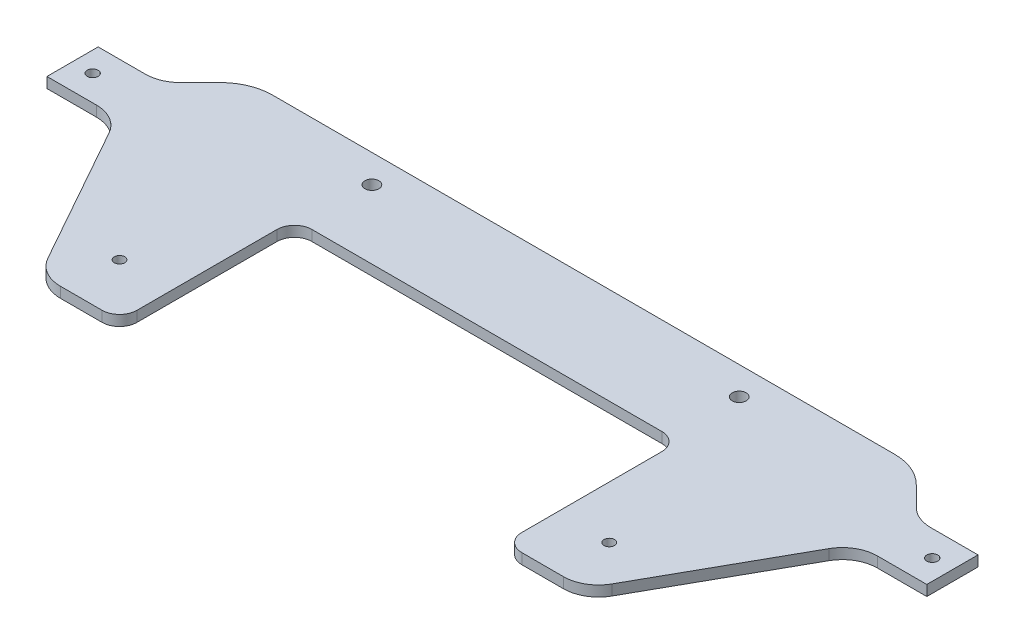
ISO-10303-21;
HEADER;
FILE_DESCRIPTION(('STEP AP214'),'2;1');
FILE_NAME('part.step','',(''),(''),'','','');
FILE_SCHEMA(('AUTOMOTIVE_DESIGN { 1 0 10303 214 1 1 1 1 }'));
ENDSEC;
DATA;
#1=APPLICATION_CONTEXT('core data for automotive mechanical design processes');
#2=APPLICATION_PROTOCOL_DEFINITION('international standard','automotive_design',2000,#1);
#3=PRODUCT_CONTEXT('',#1,'mechanical');
#4=PRODUCT('Part','Part','',(#3));
#5=PRODUCT_RELATED_PRODUCT_CATEGORY('part','',(#4));
#6=PRODUCT_DEFINITION_FORMATION('','',#4);
#7=PRODUCT_DEFINITION_CONTEXT('part definition',#1,'design');
#8=PRODUCT_DEFINITION('design','',#6,#7);
#9=PRODUCT_DEFINITION_SHAPE('','',#8);
#10=(LENGTH_UNIT() NAMED_UNIT(*) SI_UNIT(.MILLI.,.METRE.));
#11=(NAMED_UNIT(*) PLANE_ANGLE_UNIT() SI_UNIT($,.RADIAN.));
#12=(NAMED_UNIT(*) SI_UNIT($,.STERADIAN.) SOLID_ANGLE_UNIT());
#13=UNCERTAINTY_MEASURE_WITH_UNIT(LENGTH_MEASURE(1.E-05),#10,'distance_accuracy_value','');
#14=(GEOMETRIC_REPRESENTATION_CONTEXT(3) GLOBAL_UNCERTAINTY_ASSIGNED_CONTEXT((#13)) GLOBAL_UNIT_ASSIGNED_CONTEXT((#10,
#11,#12)) REPRESENTATION_CONTEXT('',''));
#15=CARTESIAN_POINT('',(0.,0.,0.));
#16=DIRECTION('',(0.,0.,1.));
#17=DIRECTION('',(1.,0.,0.));
#18=AXIS2_PLACEMENT_3D('',#15,#16,#17);
#19=CARTESIAN_POINT('',(-77.75,3.,42.3181711088205));
#20=DIRECTION('',(0.,0.,-1.));
#21=DIRECTION('',(-1.,0.,0.));
#22=AXIS2_PLACEMENT_3D('',#19,#20,#21);
#23=PLANE('',#22);
#24=DIRECTION('',(1.,0.,0.));
#25=VECTOR('',#24,1.);
#26=CARTESIAN_POINT('',(-77.75,0.,42.3181711088205));
#27=LINE('',#26,#25);
#28=CARTESIAN_POINT('',(-71.8887609744845,0.,42.3181711088205));
#29=VERTEX_POINT('',#28);
#30=CARTESIAN_POINT('',(-60.,0.,42.3181711088205));
#31=VERTEX_POINT('',#30);
#32=EDGE_CURVE('E344',#29,#31,#27,.T.);
#33=ORIENTED_EDGE('',*,*,#32,.T.);
#34=DIRECTION('',(0.,1.,0.));
#35=VECTOR('',#34,1.);
#36=CARTESIAN_POINT('',(-60.,3.,42.3181711088205));
#37=LINE('',#36,#35);
#38=CARTESIAN_POINT('',(-60.,3.,42.3181711088205));
#39=VERTEX_POINT('',#38);
#40=EDGE_CURVE('E418',#31,#39,#37,.T.);
#41=ORIENTED_EDGE('',*,*,#40,.T.);
#42=DIRECTION('',(1.,0.,0.));
#43=VECTOR('',#42,1.);
#44=CARTESIAN_POINT('',(-77.75,3.,42.3181711088205));
#45=LINE('',#44,#43);
#46=CARTESIAN_POINT('',(-71.8887609744845,3.,42.3181711088205));
#47=VERTEX_POINT('',#46);
#48=EDGE_CURVE('E322',#47,#39,#45,.T.);
#49=ORIENTED_EDGE('',*,*,#48,.F.);
#50=DIRECTION('',(0.,-1.,0.));
#51=VECTOR('',#50,1.);
#52=CARTESIAN_POINT('',(-71.8887609744845,3.,42.3181711088205));
#53=LINE('',#52,#51);
#54=EDGE_CURVE('E372',#47,#29,#53,.T.);
#55=ORIENTED_EDGE('',*,*,#54,.T.);
#56=EDGE_LOOP('',(#33,#41,#49,#55));
#57=FACE_BOUND('',#56,.T.);
#58=ADVANCED_FACE('F39',(#57),#23,.F.);
#59=CARTESIAN_POINT('',(-88.1,3.,-42.3181711088205));
#60=DIRECTION('',(0.707106781186547,0.,0.707106781186547));
#61=DIRECTION('',(0.707106781186548,0.,-0.707106781186548));
#62=AXIS2_PLACEMENT_3D('',#59,#60,#61);
#63=PLANE('',#62);
#64=DIRECTION('',(-0.707106781186548,0.,0.707106781186548));
#65=VECTOR('',#64,1.);
#66=CARTESIAN_POINT('',(-88.1,3.,-42.3181711088205));
#67=LINE('',#66,#65);
#68=CARTESIAN_POINT('',(-99.4933982822018,3.,-30.9247728266187));
#69=VERTEX_POINT('',#68);
#70=CARTESIAN_POINT('',(-105.171067811865,3.,-25.247103296955));
#71=VERTEX_POINT('',#70);
#72=EDGE_CURVE('E317',#69,#71,#67,.T.);
#73=ORIENTED_EDGE('',*,*,#72,.F.);
#74=DIRECTION('',(0.,-1.,0.));
#75=VECTOR('',#74,1.);
#76=CARTESIAN_POINT('',(-99.4933982822018,3.,-30.9247728266187));
#77=LINE('',#76,#75);
#78=CARTESIAN_POINT('',(-99.4933982822018,0.,-30.9247728266187));
#79=VERTEX_POINT('',#78);
#80=EDGE_CURVE('E11',#69,#79,#77,.T.);
#81=ORIENTED_EDGE('',*,*,#80,.T.);
#82=DIRECTION('',(-0.707106781186548,0.,0.707106781186548));
#83=VECTOR('',#82,1.);
#84=CARTESIAN_POINT('',(-88.1,0.,-42.3181711088205));
#85=LINE('',#84,#83);
#86=CARTESIAN_POINT('',(-105.171067811865,0.,-25.247103296955));
#87=VERTEX_POINT('',#86);
#88=EDGE_CURVE('E312',#79,#87,#85,.T.);
#89=ORIENTED_EDGE('',*,*,#88,.T.);
#90=DIRECTION('',(0.,-1.,0.));
#91=VECTOR('',#90,1.);
#92=CARTESIAN_POINT('',(-105.171067811865,3.,-25.247103296955));
#93=LINE('',#92,#91);
#94=EDGE_CURVE('E368',#87,#71,#93,.F.);
#95=ORIENTED_EDGE('',*,*,#94,.T.);
#96=EDGE_LOOP('',(#73,#81,#89,#95));
#97=FACE_BOUND('',#96,.T.);
#98=ADVANCED_FACE('F513',(#97),#63,.F.);
#99=CARTESIAN_POINT('',(-108.1,3.,-22.3181711088205));
#100=DIRECTION('',(0.,0.,1.));
#101=DIRECTION('',(1.,0.,0.));
#102=AXIS2_PLACEMENT_3D('',#99,#100,#101);
#103=PLANE('',#102);
#104=DIRECTION('',(-1.,0.,0.));
#105=VECTOR('',#104,1.);
#106=CARTESIAN_POINT('',(-108.1,0.,-22.3181711088205));
#107=LINE('',#106,#105);
#108=CARTESIAN_POINT('',(-112.242135623731,0.,-22.3181711088205));
#109=VERTEX_POINT('',#108);
#110=CARTESIAN_POINT('',(-125.75,0.,-22.3181711088205));
#111=VERTEX_POINT('',#110);
#112=EDGE_CURVE('E340',#109,#111,#107,.T.);
#113=ORIENTED_EDGE('',*,*,#112,.T.);
#114=DIRECTION('',(0.,-1.,0.));
#115=VECTOR('',#114,1.);
#116=CARTESIAN_POINT('',(-125.75,3.,-22.3181711088205));
#117=LINE('',#116,#115);
#118=CARTESIAN_POINT('',(-125.75,3.,-22.3181711088205));
#119=VERTEX_POINT('',#118);
#120=EDGE_CURVE('E250',#119,#111,#117,.T.);
#121=ORIENTED_EDGE('',*,*,#120,.F.);
#122=DIRECTION('',(-1.,0.,0.));
#123=VECTOR('',#122,1.);
#124=CARTESIAN_POINT('',(-108.1,3.,-22.3181711088205));
#125=LINE('',#124,#123);
#126=CARTESIAN_POINT('',(-112.242135623731,3.,-22.3181711088205));
#127=VERTEX_POINT('',#126);
#128=EDGE_CURVE('E236',#127,#119,#125,.T.);
#129=ORIENTED_EDGE('',*,*,#128,.F.);
#130=DIRECTION('',(0.,-1.,0.));
#131=VECTOR('',#130,1.);
#132=CARTESIAN_POINT('',(-112.242135623731,0.,-22.3181711088205));
#133=LINE('',#132,#131);
#134=EDGE_CURVE('E393',#127,#109,#133,.T.);
#135=ORIENTED_EDGE('',*,*,#134,.T.);
#136=EDGE_LOOP('',(#113,#121,#129,#135));
#137=FACE_BOUND('',#136,.T.);
#138=ADVANCED_FACE('F523',(#137),#103,.F.);
#139=CARTESIAN_POINT('',(-127.75,3.,-7.6818288911795));
#140=DIRECTION('',(0.,0.,-1.));
#141=DIRECTION('',(-1.,0.,0.));
#142=AXIS2_PLACEMENT_3D('',#139,#140,#141);
#143=PLANE('',#142);
#144=DIRECTION('',(1.,0.,0.));
#145=VECTOR('',#144,1.);
#146=CARTESIAN_POINT('',(-127.75,3.,-7.6818288911795));
#147=LINE('',#146,#145);
#148=CARTESIAN_POINT('',(-125.75,3.,-7.6818288911795));
#149=VERTEX_POINT('',#148);
#150=CARTESIAN_POINT('',(-111.611239025516,3.,-7.6818288911795));
#151=VERTEX_POINT('',#150);
#152=EDGE_CURVE('E228',#149,#151,#147,.T.);
#153=ORIENTED_EDGE('',*,*,#152,.F.);
#154=DIRECTION('',(0.,1.,0.));
#155=VECTOR('',#154,1.);
#156=CARTESIAN_POINT('',(-125.75,0.,-7.6818288911795));
#157=LINE('',#156,#155);
#158=CARTESIAN_POINT('',(-125.75,0.,-7.6818288911795));
#159=VERTEX_POINT('',#158);
#160=EDGE_CURVE('E229',#159,#149,#157,.T.);
#161=ORIENTED_EDGE('',*,*,#160,.F.);
#162=DIRECTION('',(1.,0.,0.));
#163=VECTOR('',#162,1.);
#164=CARTESIAN_POINT('',(-127.75,0.,-7.6818288911795));
#165=LINE('',#164,#163);
#166=CARTESIAN_POINT('',(-111.611239025516,0.,-7.6818288911795));
#167=VERTEX_POINT('',#166);
#168=EDGE_CURVE('E339',#159,#167,#165,.T.);
#169=ORIENTED_EDGE('',*,*,#168,.T.);
#170=DIRECTION('',(0.,-1.,0.));
#171=VECTOR('',#170,1.);
#172=CARTESIAN_POINT('',(-111.611239025516,3.,-7.6818288911795));
#173=LINE('',#172,#171);
#174=EDGE_CURVE('E235',#167,#151,#173,.F.);
#175=ORIENTED_EDGE('',*,*,#174,.T.);
#176=EDGE_LOOP('',(#153,#161,#169,#175));
#177=FACE_BOUND('',#176,.T.);
#178=ADVANCED_FACE('F226',(#177),#143,.F.);
#179=CARTESIAN_POINT('',(-105.75,3.,-7.6818288911795));
#180=DIRECTION('',(0.87250601594972,0.,-0.488603368931844));
#181=DIRECTION('',(-0.488603368931844,0.,-0.87250601594972));
#182=AXIS2_PLACEMENT_3D('',#179,#180,#181);
#183=PLANE('',#182);
#184=DIRECTION('',(0.488603368931844,0.,0.87250601594972));
#185=VECTOR('',#184,1.);
#186=CARTESIAN_POINT('',(-105.75,0.,-7.6818288911795));
#187=LINE('',#186,#185);
#188=CARTESIAN_POINT('',(-102.886178866018,0.,-2.56786258049794));
#189=VERTEX_POINT('',#188);
#190=CARTESIAN_POINT('',(-80.6138211339817,0.,37.2042047981389));
#191=VERTEX_POINT('',#190);
#192=EDGE_CURVE('E341',#189,#191,#187,.T.);
#193=ORIENTED_EDGE('',*,*,#192,.T.);
#194=DIRECTION('',(0.,-1.,0.));
#195=VECTOR('',#194,1.);
#196=CARTESIAN_POINT('',(-80.6138211339817,3.,37.2042047981389));
#197=LINE('',#196,#195);
#198=CARTESIAN_POINT('',(-80.6138211339817,3.,37.2042047981389));
#199=VERTEX_POINT('',#198);
#200=EDGE_CURVE('E379',#191,#199,#197,.F.);
#201=ORIENTED_EDGE('',*,*,#200,.T.);
#202=DIRECTION('',(0.488603368931844,0.,0.87250601594972));
#203=VECTOR('',#202,1.);
#204=CARTESIAN_POINT('',(-105.75,3.,-7.6818288911795));
#205=LINE('',#204,#203);
#206=CARTESIAN_POINT('',(-102.886178866018,3.,-2.56786258049794));
#207=VERTEX_POINT('',#206);
#208=EDGE_CURVE('E232',#207,#199,#205,.T.);
#209=ORIENTED_EDGE('',*,*,#208,.F.);
#210=DIRECTION('',(0.,-1.,0.));
#211=VECTOR('',#210,1.);
#212=CARTESIAN_POINT('',(-102.886178866018,0.,-2.56786258049794));
#213=LINE('',#212,#211);
#214=EDGE_CURVE('E380',#207,#189,#213,.T.);
#215=ORIENTED_EDGE('',*,*,#214,.T.);
#216=EDGE_LOOP('',(#193,#201,#209,#215));
#217=FACE_BOUND('',#216,.T.);
#218=ADVANCED_FACE('F526',(#217),#183,.F.);
#219=CARTESIAN_POINT('',(60.,3.,42.3181711088205));
#220=VERTEX_POINT('',#219);
#221=CARTESIAN_POINT('',(71.8887609744845,3.,42.3181711088205));
#222=VERTEX_POINT('',#221);
#223=EDGE_CURVE('E325',#220,#222,#45,.T.);
#224=ORIENTED_EDGE('',*,*,#223,.F.);
#225=DIRECTION('',(0.,1.,0.));
#226=VECTOR('',#225,1.);
#227=CARTESIAN_POINT('',(60.,3.,42.3181711088205));
#228=LINE('',#227,#226);
#229=CARTESIAN_POINT('',(60.,0.,42.3181711088205));
#230=VERTEX_POINT('',#229);
#231=EDGE_CURVE('E440',#220,#230,#228,.F.);
#232=ORIENTED_EDGE('',*,*,#231,.T.);
#233=CARTESIAN_POINT('',(71.8887609744845,0.,42.3181711088205));
#234=VERTEX_POINT('',#233);
#235=EDGE_CURVE('E343',#230,#234,#27,.T.);
#236=ORIENTED_EDGE('',*,*,#235,.T.);
#237=DIRECTION('',(0.,-1.,0.));
#238=VECTOR('',#237,1.);
#239=CARTESIAN_POINT('',(71.8887609744845,3.,42.3181711088205));
#240=LINE('',#239,#238);
#241=EDGE_CURVE('E371',#234,#222,#240,.F.);
#242=ORIENTED_EDGE('',*,*,#241,.T.);
#243=EDGE_LOOP('',(#224,#232,#236,#242));
#244=FACE_BOUND('',#243,.T.);
#245=ADVANCED_FACE('F517',(#244),#23,.F.);
#246=CARTESIAN_POINT('',(105.75,3.,-7.6818288911795));
#247=DIRECTION('',(-0.87250601594972,0.,-0.488603368931844));
#248=DIRECTION('',(-0.488603368931844,0.,0.87250601594972));
#249=AXIS2_PLACEMENT_3D('',#246,#247,#248);
#250=PLANE('',#249);
#251=DIRECTION('',(0.488603368931844,0.,-0.87250601594972));
#252=VECTOR('',#251,1.);
#253=CARTESIAN_POINT('',(105.75,3.,-7.6818288911795));
#254=LINE('',#253,#252);
#255=CARTESIAN_POINT('',(80.6138211339817,3.,37.2042047981389));
#256=VERTEX_POINT('',#255);
#257=CARTESIAN_POINT('',(102.886178866018,3.,-2.56786258049794));
#258=VERTEX_POINT('',#257);
#259=EDGE_CURVE('E329',#256,#258,#254,.T.);
#260=ORIENTED_EDGE('',*,*,#259,.F.);
#261=DIRECTION('',(0.,-1.,0.));
#262=VECTOR('',#261,1.);
#263=CARTESIAN_POINT('',(80.6138211339817,3.,37.2042047981389));
#264=LINE('',#263,#262);
#265=CARTESIAN_POINT('',(80.6138211339817,0.,37.2042047981389));
#266=VERTEX_POINT('',#265);
#267=EDGE_CURVE('E381',#256,#266,#264,.T.);
#268=ORIENTED_EDGE('',*,*,#267,.T.);
#269=DIRECTION('',(0.488603368931844,0.,-0.87250601594972));
#270=VECTOR('',#269,1.);
#271=CARTESIAN_POINT('',(105.75,0.,-7.6818288911795));
#272=LINE('',#271,#270);
#273=CARTESIAN_POINT('',(102.886178866018,0.,-2.56786258049794));
#274=VERTEX_POINT('',#273);
#275=EDGE_CURVE('E350',#266,#274,#272,.T.);
#276=ORIENTED_EDGE('',*,*,#275,.T.);
#277=DIRECTION('',(0.,-1.,0.));
#278=VECTOR('',#277,1.);
#279=CARTESIAN_POINT('',(102.886178866018,3.,-2.56786258049794));
#280=LINE('',#279,#278);
#281=EDGE_CURVE('E385',#274,#258,#280,.F.);
#282=ORIENTED_EDGE('',*,*,#281,.T.);
#283=EDGE_LOOP('',(#260,#268,#276,#282));
#284=FACE_BOUND('',#283,.T.);
#285=ADVANCED_FACE('F530',(#284),#250,.F.);
#286=CARTESIAN_POINT('',(127.75,3.,-7.6818288911795));
#287=DIRECTION('',(0.,0.,-1.));
#288=DIRECTION('',(-1.,0.,0.));
#289=AXIS2_PLACEMENT_3D('',#286,#287,#288);
#290=PLANE('',#289);
#291=DIRECTION('',(1.,0.,0.));
#292=VECTOR('',#291,1.);
#293=CARTESIAN_POINT('',(127.75,0.,-7.6818288911795));
#294=LINE('',#293,#292);
#295=CARTESIAN_POINT('',(111.611239025516,0.,-7.6818288911795));
#296=VERTEX_POINT('',#295);
#297=CARTESIAN_POINT('',(125.75,0.,-7.6818288911795));
#298=VERTEX_POINT('',#297);
#299=EDGE_CURVE('E353',#296,#298,#294,.T.);
#300=ORIENTED_EDGE('',*,*,#299,.T.);
#301=DIRECTION('',(0.,-1.,0.));
#302=VECTOR('',#301,1.);
#303=CARTESIAN_POINT('',(125.75,3.,-7.6818288911795));
#304=LINE('',#303,#302);
#305=CARTESIAN_POINT('',(125.75,3.,-7.6818288911795));
#306=VERTEX_POINT('',#305);
#307=EDGE_CURVE('E264',#306,#298,#304,.T.);
#308=ORIENTED_EDGE('',*,*,#307,.F.);
#309=DIRECTION('',(1.,0.,0.));
#310=VECTOR('',#309,1.);
#311=CARTESIAN_POINT('',(127.75,3.,-7.6818288911795));
#312=LINE('',#311,#310);
#313=CARTESIAN_POINT('',(111.611239025516,3.,-7.6818288911795));
#314=VERTEX_POINT('',#313);
#315=EDGE_CURVE('E328',#314,#306,#312,.T.);
#316=ORIENTED_EDGE('',*,*,#315,.F.);
#317=DIRECTION('',(0.,-1.,0.));
#318=VECTOR('',#317,1.);
#319=CARTESIAN_POINT('',(111.611239025516,0.,-7.6818288911795));
#320=LINE('',#319,#318);
#321=EDGE_CURVE('E389',#314,#296,#320,.T.);
#322=ORIENTED_EDGE('',*,*,#321,.T.);
#323=EDGE_LOOP('',(#300,#308,#316,#322));
#324=FACE_BOUND('',#323,.T.);
#325=ADVANCED_FACE('F536',(#324),#290,.F.);
#326=CARTESIAN_POINT('',(108.1,3.,-22.3181711088205));
#327=DIRECTION('',(0.,0.,1.));
#328=DIRECTION('',(1.,0.,0.));
#329=AXIS2_PLACEMENT_3D('',#326,#327,#328);
#330=PLANE('',#329);
#331=DIRECTION('',(-1.,0.,0.));
#332=VECTOR('',#331,1.);
#333=CARTESIAN_POINT('',(108.1,3.,-22.3181711088205));
#334=LINE('',#333,#332);
#335=CARTESIAN_POINT('',(125.75,3.,-22.3181711088205));
#336=VERTEX_POINT('',#335);
#337=CARTESIAN_POINT('',(112.242135623731,3.,-22.3181711088205));
#338=VERTEX_POINT('',#337);
#339=EDGE_CURVE('E333',#336,#338,#334,.T.);
#340=ORIENTED_EDGE('',*,*,#339,.F.);
#341=DIRECTION('',(0.,1.,0.));
#342=VECTOR('',#341,1.);
#343=CARTESIAN_POINT('',(125.75,3.,-22.3181711088205));
#344=LINE('',#343,#342);
#345=CARTESIAN_POINT('',(125.75,0.,-22.3181711088205));
#346=VERTEX_POINT('',#345);
#347=EDGE_CURVE('E269',#346,#336,#344,.T.);
#348=ORIENTED_EDGE('',*,*,#347,.F.);
#349=DIRECTION('',(-1.,0.,0.));
#350=VECTOR('',#349,1.);
#351=CARTESIAN_POINT('',(108.1,0.,-22.3181711088205));
#352=LINE('',#351,#350);
#353=CARTESIAN_POINT('',(112.242135623731,0.,-22.3181711088205));
#354=VERTEX_POINT('',#353);
#355=EDGE_CURVE('E352',#346,#354,#352,.T.);
#356=ORIENTED_EDGE('',*,*,#355,.T.);
#357=DIRECTION('',(0.,-1.,0.));
#358=VECTOR('',#357,1.);
#359=CARTESIAN_POINT('',(112.242135623731,3.,-22.3181711088205));
#360=LINE('',#359,#358);
#361=EDGE_CURVE('E390',#354,#338,#360,.F.);
#362=ORIENTED_EDGE('',*,*,#361,.T.);
#363=EDGE_LOOP('',(#340,#348,#356,#362));
#364=FACE_BOUND('',#363,.T.);
#365=ADVANCED_FACE('F509',(#364),#330,.F.);
#366=CARTESIAN_POINT('',(88.1,3.,-42.3181711088205));
#367=DIRECTION('',(-0.707106781186547,0.,0.707106781186547));
#368=DIRECTION('',(0.707106781186548,0.,0.707106781186548));
#369=AXIS2_PLACEMENT_3D('',#366,#367,#368);
#370=PLANE('',#369);
#371=DIRECTION('',(-0.707106781186548,0.,-0.707106781186548));
#372=VECTOR('',#371,1.);
#373=CARTESIAN_POINT('',(88.1,0.,-42.3181711088205));
#374=LINE('',#373,#372);
#375=CARTESIAN_POINT('',(105.171067811865,0.,-25.247103296955));
#376=VERTEX_POINT('',#375);
#377=CARTESIAN_POINT('',(99.4933982822018,0.,-30.9247728266187));
#378=VERTEX_POINT('',#377);
#379=EDGE_CURVE('E319',#376,#378,#374,.T.);
#380=ORIENTED_EDGE('',*,*,#379,.T.);
#381=DIRECTION('',(0.,1.,0.));
#382=VECTOR('',#381,1.);
#383=CARTESIAN_POINT('',(99.4933982822018,3.,-30.9247728266187));
#384=LINE('',#383,#382);
#385=CARTESIAN_POINT('',(99.4933982822018,3.,-30.9247728266187));
#386=VERTEX_POINT('',#385);
#387=EDGE_CURVE('E455',#378,#386,#384,.T.);
#388=ORIENTED_EDGE('',*,*,#387,.T.);
#389=DIRECTION('',(-0.707106781186548,0.,-0.707106781186548));
#390=VECTOR('',#389,1.);
#391=CARTESIAN_POINT('',(88.1,3.,-42.3181711088205));
#392=LINE('',#391,#390);
#393=CARTESIAN_POINT('',(105.171067811865,3.,-25.247103296955));
#394=VERTEX_POINT('',#393);
#395=EDGE_CURVE('E332',#394,#386,#392,.T.);
#396=ORIENTED_EDGE('',*,*,#395,.F.);
#397=DIRECTION('',(0.,-1.,0.));
#398=VECTOR('',#397,1.);
#399=CARTESIAN_POINT('',(105.171067811865,0.,-25.247103296955));
#400=LINE('',#399,#398);
#401=EDGE_CURVE('E363',#394,#376,#400,.T.);
#402=ORIENTED_EDGE('',*,*,#401,.T.);
#403=EDGE_LOOP('',(#380,#388,#396,#402));
#404=FACE_BOUND('',#403,.T.);
#405=ADVANCED_FACE('F469',(#404),#370,.F.);
#406=CARTESIAN_POINT('',(0.,3.,0.));
#407=DIRECTION('',(0.,1.,0.));
#408=DIRECTION('',(0.,0.,1.));
#409=AXIS2_PLACEMENT_3D('',#406,#407,#408);
#410=PLANE('',#409);
#411=CARTESIAN_POINT('',(-52.5,3.,-27.3181711088205));
#412=DIRECTION('',(0.,1.,0.));
#413=DIRECTION('',(0.,0.,1.));
#414=AXIS2_PLACEMENT_3D('',#411,#412,#413);
#415=CIRCLE('',#414,2.);
#416=CARTESIAN_POINT('',(-52.5,3.,-25.3181711088205));
#417=VERTEX_POINT('',#416);
#418=EDGE_CURVE('E480',#417,#417,#415,.T.);
#419=ORIENTED_EDGE('',*,*,#418,.F.);
#420=EDGE_LOOP('',(#419));
#421=FACE_BOUND('',#420,.T.);
#422=CARTESIAN_POINT('',(52.5,3.,-27.3181711088205));
#423=DIRECTION('',(0.,1.,0.));
#424=DIRECTION('',(0.,0.,1.));
#425=AXIS2_PLACEMENT_3D('',#422,#423,#424);
#426=CIRCLE('',#425,2.);
#427=CARTESIAN_POINT('',(52.5,3.,-25.3181711088205));
#428=VERTEX_POINT('',#427);
#429=EDGE_CURVE('E482',#428,#428,#426,.T.);
#430=ORIENTED_EDGE('',*,*,#429,.F.);
#431=EDGE_LOOP('',(#430));
#432=FACE_BOUND('',#431,.T.);
#433=ORIENTED_EDGE('',*,*,#395,.T.);
#434=CARTESIAN_POINT('',(88.8867965644036,3.,-20.3181711088205));
#435=DIRECTION('',(0.,1.,0.));
#436=DIRECTION('',(0.,0.,1.));
#437=AXIS2_PLACEMENT_3D('',#434,#435,#436);
#438=CIRCLE('',#437,15.);
#439=CARTESIAN_POINT('',(88.8867965644036,3.,-35.3181711088205));
#440=VERTEX_POINT('',#439);
#441=EDGE_CURVE('E456',#386,#440,#438,.T.);
#442=ORIENTED_EDGE('',*,*,#441,.T.);
#443=DIRECTION('',(1.,0.,0.));
#444=VECTOR('',#443,1.);
#445=CARTESIAN_POINT('',(-98.1,3.,-35.3181711088205));
#446=LINE('',#445,#444);
#447=CARTESIAN_POINT('',(-88.8867965644036,3.,-35.3181711088205));
#448=VERTEX_POINT('',#447);
#449=EDGE_CURVE('E253',#448,#440,#446,.T.);
#450=ORIENTED_EDGE('',*,*,#449,.F.);
#451=CARTESIAN_POINT('',(-88.8867965644036,3.,-20.3181711088205));
#452=DIRECTION('',(0.,1.,0.));
#453=DIRECTION('',(0.,0.,1.));
#454=AXIS2_PLACEMENT_3D('',#451,#452,#453);
#455=CIRCLE('',#454,15.);
#456=EDGE_CURVE('E454',#448,#69,#455,.T.);
#457=ORIENTED_EDGE('',*,*,#456,.T.);
#458=ORIENTED_EDGE('',*,*,#72,.T.);
#459=CARTESIAN_POINT('',(-112.242135623731,3.,-32.3181711088205));
#460=DIRECTION('',(0.,1.,0.));
#461=DIRECTION('',(0.,0.,1.));
#462=AXIS2_PLACEMENT_3D('',#459,#460,#461);
#463=CIRCLE('',#462,10.);
#464=EDGE_CURVE('E413',#71,#127,#463,.F.);
#465=ORIENTED_EDGE('',*,*,#464,.T.);
#466=ORIENTED_EDGE('',*,*,#128,.T.);
#467=DIRECTION('',(0.,0.,-1.));
#468=VECTOR('',#467,1.);
#469=CARTESIAN_POINT('',(-125.75,3.,-7.6818288911795));
#470=LINE('',#469,#468);
#471=EDGE_CURVE('E237',#149,#119,#470,.T.);
#472=ORIENTED_EDGE('',*,*,#471,.F.);
#473=ORIENTED_EDGE('',*,*,#152,.T.);
#474=CARTESIAN_POINT('',(-111.611239025516,3.,2.3181711088205));
#475=DIRECTION('',(0.,1.,0.));
#476=DIRECTION('',(0.,0.,1.));
#477=AXIS2_PLACEMENT_3D('',#474,#475,#476);
#478=CIRCLE('',#477,10.);
#479=EDGE_CURVE('E408',#151,#207,#478,.F.);
#480=ORIENTED_EDGE('',*,*,#479,.T.);
#481=ORIENTED_EDGE('',*,*,#208,.T.);
#482=CARTESIAN_POINT('',(-71.8887609744845,3.,32.3181711088205));
#483=DIRECTION('',(0.,1.,0.));
#484=DIRECTION('',(0.,0.,1.));
#485=AXIS2_PLACEMENT_3D('',#482,#483,#484);
#486=CIRCLE('',#485,10.);
#487=EDGE_CURVE('E366',#199,#47,#486,.T.);
#488=ORIENTED_EDGE('',*,*,#487,.T.);
#489=ORIENTED_EDGE('',*,*,#48,.T.);
#490=CARTESIAN_POINT('',(-60.,3.,37.3181711088205));
#491=DIRECTION('',(0.,1.,0.));
#492=DIRECTION('',(0.,0.,1.));
#493=AXIS2_PLACEMENT_3D('',#490,#491,#492);
#494=CIRCLE('',#493,5.);
#495=CARTESIAN_POINT('',(-55.,3.,37.3181711088205));
#496=VERTEX_POINT('',#495);
#497=EDGE_CURVE('E423',#39,#496,#494,.T.);
#498=ORIENTED_EDGE('',*,*,#497,.T.);
#499=DIRECTION('',(0.,0.,1.));
#500=VECTOR('',#499,1.);
#501=CARTESIAN_POINT('',(-55.,3.,42.3181711088205));
#502=LINE('',#501,#500);
#503=CARTESIAN_POINT('',(-55.,3.,-2.68182889117948));
#504=VERTEX_POINT('',#503);
#505=EDGE_CURVE('E277',#504,#496,#502,.T.);
#506=ORIENTED_EDGE('',*,*,#505,.F.);
#507=CARTESIAN_POINT('',(-50.,3.,-2.68182889117948));
#508=DIRECTION('',(0.,1.,0.));
#509=DIRECTION('',(0.,0.,1.));
#510=AXIS2_PLACEMENT_3D('',#507,#508,#509);
#511=CIRCLE('',#510,5.);
#512=CARTESIAN_POINT('',(-50.,3.,-7.68182889117949));
#513=VERTEX_POINT('',#512);
#514=EDGE_CURVE('E449',#504,#513,#511,.F.);
#515=ORIENTED_EDGE('',*,*,#514,.T.);
#516=DIRECTION('',(-1.,0.,0.));
#517=VECTOR('',#516,1.);
#518=CARTESIAN_POINT('',(-55.,3.,-7.68182889117949));
#519=LINE('',#518,#517);
#520=CARTESIAN_POINT('',(50.,3.,-7.68182889117949));
#521=VERTEX_POINT('',#520);
#522=EDGE_CURVE('E289',#521,#513,#519,.T.);
#523=ORIENTED_EDGE('',*,*,#522,.F.);
#524=CARTESIAN_POINT('',(50.,3.,-2.68182889117949));
#525=DIRECTION('',(0.,1.,0.));
#526=DIRECTION('',(0.,0.,1.));
#527=AXIS2_PLACEMENT_3D('',#524,#525,#526);
#528=CIRCLE('',#527,5.);
#529=CARTESIAN_POINT('',(55.,3.,-2.68182889117949));
#530=VERTEX_POINT('',#529);
#531=EDGE_CURVE('E443',#521,#530,#528,.F.);
#532=ORIENTED_EDGE('',*,*,#531,.T.);
#533=DIRECTION('',(0.,0.,-1.));
#534=VECTOR('',#533,1.);
#535=CARTESIAN_POINT('',(55.,3.,-7.68182889117949));
#536=LINE('',#535,#534);
#537=CARTESIAN_POINT('',(55.,3.,37.3181711088205));
#538=VERTEX_POINT('',#537);
#539=EDGE_CURVE('E271',#538,#530,#536,.T.);
#540=ORIENTED_EDGE('',*,*,#539,.F.);
#541=CARTESIAN_POINT('',(60.,3.,37.3181711088205));
#542=DIRECTION('',(0.,1.,0.));
#543=DIRECTION('',(0.,0.,1.));
#544=AXIS2_PLACEMENT_3D('',#541,#542,#543);
#545=CIRCLE('',#544,5.);
#546=EDGE_CURVE('E420',#538,#220,#545,.T.);
#547=ORIENTED_EDGE('',*,*,#546,.T.);
#548=ORIENTED_EDGE('',*,*,#223,.T.);
#549=CARTESIAN_POINT('',(71.8887609744845,3.,32.3181711088205));
#550=DIRECTION('',(0.,1.,0.));
#551=DIRECTION('',(0.,0.,1.));
#552=AXIS2_PLACEMENT_3D('',#549,#550,#551);
#553=CIRCLE('',#552,10.);
#554=EDGE_CURVE('E364',#222,#256,#553,.T.);
#555=ORIENTED_EDGE('',*,*,#554,.T.);
#556=ORIENTED_EDGE('',*,*,#259,.T.);
#557=CARTESIAN_POINT('',(111.611239025516,3.,2.3181711088205));
#558=DIRECTION('',(0.,1.,0.));
#559=DIRECTION('',(0.,0.,1.));
#560=AXIS2_PLACEMENT_3D('',#557,#558,#559);
#561=CIRCLE('',#560,10.);
#562=EDGE_CURVE('E404',#258,#314,#561,.F.);
#563=ORIENTED_EDGE('',*,*,#562,.T.);
#564=ORIENTED_EDGE('',*,*,#315,.T.);
#565=DIRECTION('',(0.,0.,1.));
#566=VECTOR('',#565,1.);
#567=CARTESIAN_POINT('',(125.75,3.,-7.6818288911795));
#568=LINE('',#567,#566);
#569=EDGE_CURVE('E266',#336,#306,#568,.T.);
#570=ORIENTED_EDGE('',*,*,#569,.F.);
#571=ORIENTED_EDGE('',*,*,#339,.T.);
#572=CARTESIAN_POINT('',(112.242135623731,3.,-32.3181711088205));
#573=DIRECTION('',(0.,1.,0.));
#574=DIRECTION('',(0.,0.,1.));
#575=AXIS2_PLACEMENT_3D('',#572,#573,#574);
#576=CIRCLE('',#575,10.);
#577=EDGE_CURVE('E396',#338,#394,#576,.F.);
#578=ORIENTED_EDGE('',*,*,#577,.T.);
#579=EDGE_LOOP('',(#433,#442,#450,#457,#458,#465,#466,#472,#473,#480,#481,#488,#489,#498,#506,
#515,#523,#532,#540,#547,#548,#555,#556,#563,#564,#570,#571,#578));
#580=FACE_BOUND('',#579,.T.);
#581=CARTESIAN_POINT('',(-70.,3.,27.3181711088205));
#582=DIRECTION('',(0.,1.,0.));
#583=DIRECTION('',(0.,0.,1.));
#584=AXIS2_PLACEMENT_3D('',#581,#582,#583);
#585=CIRCLE('',#584,1.5);
#586=CARTESIAN_POINT('',(-70.,3.,28.8181711088205));
#587=VERTEX_POINT('',#586);
#588=EDGE_CURVE('E292',#587,#587,#585,.T.);
#589=ORIENTED_EDGE('',*,*,#588,.F.);
#590=EDGE_LOOP('',(#589));
#591=FACE_BOUND('',#590,.T.);
#592=CARTESIAN_POINT('',(-119.996067811865,3.,-15.));
#593=DIRECTION('',(0.,1.,0.));
#594=DIRECTION('',(0.,0.,1.));
#595=AXIS2_PLACEMENT_3D('',#592,#593,#594);
#596=CIRCLE('',#595,1.54999999999999);
#597=CARTESIAN_POINT('',(-119.996067811865,3.,-13.45));
#598=VERTEX_POINT('',#597);
#599=EDGE_CURVE('E299',#598,#598,#596,.T.);
#600=ORIENTED_EDGE('',*,*,#599,.F.);
#601=EDGE_LOOP('',(#600));
#602=FACE_BOUND('',#601,.T.);
#603=CARTESIAN_POINT('',(119.996067811865,3.,-15.));
#604=DIRECTION('',(0.,1.,0.));
#605=DIRECTION('',(0.,0.,1.));
#606=AXIS2_PLACEMENT_3D('',#603,#604,#605);
#607=CIRCLE('',#606,1.54999999999999);
#608=CARTESIAN_POINT('',(119.996067811865,3.,-13.45));
#609=VERTEX_POINT('',#608);
#610=EDGE_CURVE('E304',#609,#609,#607,.T.);
#611=ORIENTED_EDGE('',*,*,#610,.F.);
#612=EDGE_LOOP('',(#611));
#613=FACE_BOUND('',#612,.T.);
#614=CARTESIAN_POINT('',(70.,3.,27.3181711088205));
#615=DIRECTION('',(0.,1.,0.));
#616=DIRECTION('',(0.,0.,1.));
#617=AXIS2_PLACEMENT_3D('',#614,#615,#616);
#618=CIRCLE('',#617,1.5);
#619=CARTESIAN_POINT('',(70.,3.,28.8181711088205));
#620=VERTEX_POINT('',#619);
#621=EDGE_CURVE('E294',#620,#620,#618,.T.);
#622=ORIENTED_EDGE('',*,*,#621,.F.);
#623=EDGE_LOOP('',(#622));
#624=FACE_BOUND('',#623,.T.);
#625=ADVANCED_FACE('F241',(#421,#432,#580,#591,#602,#613,#624),#410,.T.);
#626=CARTESIAN_POINT('',(0.,0.,0.));
#627=DIRECTION('',(0.,1.,0.));
#628=DIRECTION('',(0.,0.,1.));
#629=AXIS2_PLACEMENT_3D('',#626,#627,#628);
#630=PLANE('',#629);
#631=CARTESIAN_POINT('',(-52.5,0.,-27.3181711088205));
#632=DIRECTION('',(0.,1.,0.));
#633=DIRECTION('',(0.,0.,1.));
#634=AXIS2_PLACEMENT_3D('',#631,#632,#633);
#635=CIRCLE('',#634,2.);
#636=CARTESIAN_POINT('',(-52.5,0.,-25.3181711088205));
#637=VERTEX_POINT('',#636);
#638=EDGE_CURVE('E479',#637,#637,#635,.T.);
#639=ORIENTED_EDGE('',*,*,#638,.T.);
#640=EDGE_LOOP('',(#639));
#641=FACE_BOUND('',#640,.T.);
#642=CARTESIAN_POINT('',(52.5,0.,-27.3181711088205));
#643=DIRECTION('',(0.,1.,0.));
#644=DIRECTION('',(0.,0.,1.));
#645=AXIS2_PLACEMENT_3D('',#642,#643,#644);
#646=CIRCLE('',#645,2.);
#647=CARTESIAN_POINT('',(52.5,0.,-25.3181711088205));
#648=VERTEX_POINT('',#647);
#649=EDGE_CURVE('E486',#648,#648,#646,.T.);
#650=ORIENTED_EDGE('',*,*,#649,.T.);
#651=EDGE_LOOP('',(#650));
#652=FACE_BOUND('',#651,.T.);
#653=CARTESIAN_POINT('',(-70.,0.,27.3181711088205));
#654=DIRECTION('',(0.,1.,0.));
#655=DIRECTION('',(0.,0.,1.));
#656=AXIS2_PLACEMENT_3D('',#653,#654,#655);
#657=CIRCLE('',#656,1.5);
#658=CARTESIAN_POINT('',(-70.,0.,28.8181711088205));
#659=VERTEX_POINT('',#658);
#660=EDGE_CURVE('E298',#659,#659,#657,.T.);
#661=ORIENTED_EDGE('',*,*,#660,.T.);
#662=EDGE_LOOP('',(#661));
#663=FACE_BOUND('',#662,.T.);
#664=CARTESIAN_POINT('',(-119.996067811865,0.,-15.));
#665=DIRECTION('',(0.,1.,0.));
#666=DIRECTION('',(0.,0.,1.));
#667=AXIS2_PLACEMENT_3D('',#664,#665,#666);
#668=CIRCLE('',#667,1.54999999999999);
#669=CARTESIAN_POINT('',(-119.996067811865,0.,-13.45));
#670=VERTEX_POINT('',#669);
#671=EDGE_CURVE('E305',#670,#670,#668,.T.);
#672=ORIENTED_EDGE('',*,*,#671,.T.);
#673=EDGE_LOOP('',(#672));
#674=FACE_BOUND('',#673,.T.);
#675=CARTESIAN_POINT('',(119.996067811865,0.,-15.));
#676=DIRECTION('',(0.,1.,0.));
#677=DIRECTION('',(0.,0.,1.));
#678=AXIS2_PLACEMENT_3D('',#675,#676,#677);
#679=CIRCLE('',#678,1.54999999999999);
#680=CARTESIAN_POINT('',(119.996067811865,0.,-13.45));
#681=VERTEX_POINT('',#680);
#682=EDGE_CURVE('E283',#681,#681,#679,.T.);
#683=ORIENTED_EDGE('',*,*,#682,.T.);
#684=EDGE_LOOP('',(#683));
#685=FACE_BOUND('',#684,.T.);
#686=CARTESIAN_POINT('',(70.,0.,27.3181711088205));
#687=DIRECTION('',(0.,1.,0.));
#688=DIRECTION('',(0.,0.,1.));
#689=AXIS2_PLACEMENT_3D('',#686,#687,#688);
#690=CIRCLE('',#689,1.5);
#691=CARTESIAN_POINT('',(70.,0.,28.8181711088205));
#692=VERTEX_POINT('',#691);
#693=EDGE_CURVE('E309',#692,#692,#690,.T.);
#694=ORIENTED_EDGE('',*,*,#693,.T.);
#695=EDGE_LOOP('',(#694));
#696=FACE_BOUND('',#695,.T.);
#697=DIRECTION('',(1.,0.,0.));
#698=VECTOR('',#697,1.);
#699=CARTESIAN_POINT('',(-98.1,0.,-35.3181711088205));
#700=LINE('',#699,#698);
#701=CARTESIAN_POINT('',(-88.8867965644036,0.,-35.3181711088205));
#702=VERTEX_POINT('',#701);
#703=CARTESIAN_POINT('',(88.8867965644036,0.,-35.3181711088205));
#704=VERTEX_POINT('',#703);
#705=EDGE_CURVE('E254',#702,#704,#700,.T.);
#706=ORIENTED_EDGE('',*,*,#705,.T.);
#707=CARTESIAN_POINT('',(88.8867965644036,0.,-20.3181711088205));
#708=DIRECTION('',(0.,1.,0.));
#709=DIRECTION('',(0.,0.,1.));
#710=AXIS2_PLACEMENT_3D('',#707,#708,#709);
#711=CIRCLE('',#710,15.);
#712=EDGE_CURVE('E50',#704,#378,#711,.F.);
#713=ORIENTED_EDGE('',*,*,#712,.T.);
#714=ORIENTED_EDGE('',*,*,#379,.F.);
#715=CARTESIAN_POINT('',(112.242135623731,0.,-32.3181711088205));
#716=DIRECTION('',(0.,1.,0.));
#717=DIRECTION('',(0.,0.,1.));
#718=AXIS2_PLACEMENT_3D('',#715,#716,#717);
#719=CIRCLE('',#718,10.);
#720=EDGE_CURVE('E399',#376,#354,#719,.T.);
#721=ORIENTED_EDGE('',*,*,#720,.T.);
#722=ORIENTED_EDGE('',*,*,#355,.F.);
#723=DIRECTION('',(0.,0.,-1.));
#724=VECTOR('',#723,1.);
#725=CARTESIAN_POINT('',(125.75,0.,-22.3181711088205));
#726=LINE('',#725,#724);
#727=EDGE_CURVE('E263',#298,#346,#726,.T.);
#728=ORIENTED_EDGE('',*,*,#727,.F.);
#729=ORIENTED_EDGE('',*,*,#299,.F.);
#730=CARTESIAN_POINT('',(111.611239025516,0.,2.3181711088205));
#731=DIRECTION('',(0.,1.,0.));
#732=DIRECTION('',(0.,0.,1.));
#733=AXIS2_PLACEMENT_3D('',#730,#731,#732);
#734=CIRCLE('',#733,10.);
#735=EDGE_CURVE('E405',#296,#274,#734,.T.);
#736=ORIENTED_EDGE('',*,*,#735,.T.);
#737=ORIENTED_EDGE('',*,*,#275,.F.);
#738=CARTESIAN_POINT('',(71.8887609744845,0.,32.3181711088205));
#739=DIRECTION('',(0.,1.,0.));
#740=DIRECTION('',(0.,0.,1.));
#741=AXIS2_PLACEMENT_3D('',#738,#739,#740);
#742=CIRCLE('',#741,10.);
#743=EDGE_CURVE('E331',#266,#234,#742,.F.);
#744=ORIENTED_EDGE('',*,*,#743,.T.);
#745=ORIENTED_EDGE('',*,*,#235,.F.);
#746=CARTESIAN_POINT('',(60.,0.,37.3181711088205));
#747=DIRECTION('',(0.,1.,0.));
#748=DIRECTION('',(0.,0.,1.));
#749=AXIS2_PLACEMENT_3D('',#746,#747,#748);
#750=CIRCLE('',#749,5.);
#751=CARTESIAN_POINT('',(55.,0.,37.3181711088205));
#752=VERTEX_POINT('',#751);
#753=EDGE_CURVE('E426',#230,#752,#750,.F.);
#754=ORIENTED_EDGE('',*,*,#753,.T.);
#755=DIRECTION('',(0.,0.,-1.));
#756=VECTOR('',#755,1.);
#757=CARTESIAN_POINT('',(55.,0.,-7.68182889117949));
#758=LINE('',#757,#756);
#759=CARTESIAN_POINT('',(55.,0.,-2.68182889117949));
#760=VERTEX_POINT('',#759);
#761=EDGE_CURVE('E274',#752,#760,#758,.T.);
#762=ORIENTED_EDGE('',*,*,#761,.T.);
#763=CARTESIAN_POINT('',(50.,0.,-2.68182889117949));
#764=DIRECTION('',(0.,1.,0.));
#765=DIRECTION('',(0.,0.,1.));
#766=AXIS2_PLACEMENT_3D('',#763,#764,#765);
#767=CIRCLE('',#766,5.);
#768=CARTESIAN_POINT('',(50.,0.,-7.68182889117949));
#769=VERTEX_POINT('',#768);
#770=EDGE_CURVE('E447',#760,#769,#767,.T.);
#771=ORIENTED_EDGE('',*,*,#770,.T.);
#772=DIRECTION('',(-1.,0.,0.));
#773=VECTOR('',#772,1.);
#774=CARTESIAN_POINT('',(-55.,0.,-7.68182889117949));
#775=LINE('',#774,#773);
#776=CARTESIAN_POINT('',(-50.,0.,-7.68182889117949));
#777=VERTEX_POINT('',#776);
#778=EDGE_CURVE('E280',#769,#777,#775,.T.);
#779=ORIENTED_EDGE('',*,*,#778,.T.);
#780=CARTESIAN_POINT('',(-50.,0.,-2.68182889117948));
#781=DIRECTION('',(0.,1.,0.));
#782=DIRECTION('',(0.,0.,1.));
#783=AXIS2_PLACEMENT_3D('',#780,#781,#782);
#784=CIRCLE('',#783,5.);
#785=CARTESIAN_POINT('',(-55.,0.,-2.68182889117948));
#786=VERTEX_POINT('',#785);
#787=EDGE_CURVE('E448',#777,#786,#784,.T.);
#788=ORIENTED_EDGE('',*,*,#787,.T.);
#789=DIRECTION('',(0.,0.,1.));
#790=VECTOR('',#789,1.);
#791=CARTESIAN_POINT('',(-55.,0.,42.3181711088205));
#792=LINE('',#791,#790);
#793=CARTESIAN_POINT('',(-55.,0.,37.3181711088205));
#794=VERTEX_POINT('',#793);
#795=EDGE_CURVE('E284',#786,#794,#792,.T.);
#796=ORIENTED_EDGE('',*,*,#795,.T.);
#797=CARTESIAN_POINT('',(-60.,0.,37.3181711088205));
#798=DIRECTION('',(0.,1.,0.));
#799=DIRECTION('',(0.,0.,1.));
#800=AXIS2_PLACEMENT_3D('',#797,#798,#799);
#801=CIRCLE('',#800,5.);
#802=EDGE_CURVE('E427',#794,#31,#801,.F.);
#803=ORIENTED_EDGE('',*,*,#802,.T.);
#804=ORIENTED_EDGE('',*,*,#32,.F.);
#805=CARTESIAN_POINT('',(-71.8887609744845,0.,32.3181711088205));
#806=DIRECTION('',(0.,1.,0.));
#807=DIRECTION('',(0.,0.,1.));
#808=AXIS2_PLACEMENT_3D('',#805,#806,#807);
#809=CIRCLE('',#808,10.);
#810=EDGE_CURVE('E360',#29,#191,#809,.F.);
#811=ORIENTED_EDGE('',*,*,#810,.T.);
#812=ORIENTED_EDGE('',*,*,#192,.F.);
#813=CARTESIAN_POINT('',(-111.611239025516,0.,2.3181711088205));
#814=DIRECTION('',(0.,1.,0.));
#815=DIRECTION('',(0.,0.,1.));
#816=AXIS2_PLACEMENT_3D('',#813,#814,#815);
#817=CIRCLE('',#816,10.);
#818=EDGE_CURVE('E406',#189,#167,#817,.T.);
#819=ORIENTED_EDGE('',*,*,#818,.T.);
#820=ORIENTED_EDGE('',*,*,#168,.F.);
#821=DIRECTION('',(0.,0.,1.));
#822=VECTOR('',#821,1.);
#823=CARTESIAN_POINT('',(-125.75,0.,-22.3181711088205));
#824=LINE('',#823,#822);
#825=EDGE_CURVE('E255',#111,#159,#824,.T.);
#826=ORIENTED_EDGE('',*,*,#825,.F.);
#827=ORIENTED_EDGE('',*,*,#112,.F.);
#828=CARTESIAN_POINT('',(-112.242135623731,0.,-32.3181711088205));
#829=DIRECTION('',(0.,1.,0.));
#830=DIRECTION('',(0.,0.,1.));
#831=AXIS2_PLACEMENT_3D('',#828,#829,#830);
#832=CIRCLE('',#831,10.);
#833=EDGE_CURVE('E414',#109,#87,#832,.T.);
#834=ORIENTED_EDGE('',*,*,#833,.T.);
#835=ORIENTED_EDGE('',*,*,#88,.F.);
#836=CARTESIAN_POINT('',(-88.8867965644036,0.,-20.3181711088205));
#837=DIRECTION('',(0.,1.,0.));
#838=DIRECTION('',(0.,0.,1.));
#839=AXIS2_PLACEMENT_3D('',#836,#837,#838);
#840=CIRCLE('',#839,15.);
#841=EDGE_CURVE('E53',#79,#702,#840,.F.);
#842=ORIENTED_EDGE('',*,*,#841,.T.);
#843=EDGE_LOOP('',(#706,#713,#714,#721,#722,#728,#729,#736,#737,#744,#745,#754,#762,#771,#779,
#788,#796,#803,#804,#811,#812,#819,#820,#826,#827,#834,#835,#842));
#844=FACE_BOUND('',#843,.T.);
#845=ADVANCED_FACE('F461',(#641,#652,#663,#674,#685,#696,#844),#630,.F.);
#846=CARTESIAN_POINT('',(-71.8887609744845,3.,32.3181711088205));
#847=DIRECTION('',(0.,-1.,0.));
#848=DIRECTION('',(0.,0.,-1.));
#849=AXIS2_PLACEMENT_3D('',#846,#847,#848);
#850=CYLINDRICAL_SURFACE('',#849,10.);
#851=ORIENTED_EDGE('',*,*,#487,.F.);
#852=ORIENTED_EDGE('',*,*,#200,.F.);
#853=ORIENTED_EDGE('',*,*,#810,.F.);
#854=ORIENTED_EDGE('',*,*,#54,.F.);
#855=EDGE_LOOP('',(#851,#852,#853,#854));
#856=FACE_BOUND('',#855,.T.);
#857=ADVANCED_FACE('F507',(#856),#850,.T.);
#858=CARTESIAN_POINT('',(71.8887609744845,3.,32.3181711088205));
#859=DIRECTION('',(0.,-1.,0.));
#860=DIRECTION('',(0.,0.,-1.));
#861=AXIS2_PLACEMENT_3D('',#858,#859,#860);
#862=CYLINDRICAL_SURFACE('',#861,10.);
#863=ORIENTED_EDGE('',*,*,#554,.F.);
#864=ORIENTED_EDGE('',*,*,#241,.F.);
#865=ORIENTED_EDGE('',*,*,#743,.F.);
#866=ORIENTED_EDGE('',*,*,#267,.F.);
#867=EDGE_LOOP('',(#863,#864,#865,#866));
#868=FACE_BOUND('',#867,.T.);
#869=ADVANCED_FACE('F628',(#868),#862,.T.);
#870=CARTESIAN_POINT('',(112.242135623731,3.,-32.3181711088205));
#871=DIRECTION('',(0.,1.,0.));
#872=DIRECTION('',(0.,0.,1.));
#873=AXIS2_PLACEMENT_3D('',#870,#871,#872);
#874=CYLINDRICAL_SURFACE('',#873,10.);
#875=ORIENTED_EDGE('',*,*,#577,.F.);
#876=ORIENTED_EDGE('',*,*,#361,.F.);
#877=ORIENTED_EDGE('',*,*,#720,.F.);
#878=ORIENTED_EDGE('',*,*,#401,.F.);
#879=EDGE_LOOP('',(#875,#876,#877,#878));
#880=FACE_BOUND('',#879,.T.);
#881=ADVANCED_FACE('F624',(#880),#874,.F.);
#882=CARTESIAN_POINT('',(111.611239025516,3.,2.3181711088205));
#883=DIRECTION('',(0.,1.,0.));
#884=DIRECTION('',(0.,0.,1.));
#885=AXIS2_PLACEMENT_3D('',#882,#883,#884);
#886=CYLINDRICAL_SURFACE('',#885,10.);
#887=ORIENTED_EDGE('',*,*,#562,.F.);
#888=ORIENTED_EDGE('',*,*,#281,.F.);
#889=ORIENTED_EDGE('',*,*,#735,.F.);
#890=ORIENTED_EDGE('',*,*,#321,.F.);
#891=EDGE_LOOP('',(#887,#888,#889,#890));
#892=FACE_BOUND('',#891,.T.);
#893=ADVANCED_FACE('F623',(#892),#886,.F.);
#894=CARTESIAN_POINT('',(-111.611239025516,3.,2.3181711088205));
#895=DIRECTION('',(0.,1.,0.));
#896=DIRECTION('',(0.,0.,1.));
#897=AXIS2_PLACEMENT_3D('',#894,#895,#896);
#898=CYLINDRICAL_SURFACE('',#897,10.);
#899=ORIENTED_EDGE('',*,*,#479,.F.);
#900=ORIENTED_EDGE('',*,*,#174,.F.);
#901=ORIENTED_EDGE('',*,*,#818,.F.);
#902=ORIENTED_EDGE('',*,*,#214,.F.);
#903=EDGE_LOOP('',(#899,#900,#901,#902));
#904=FACE_BOUND('',#903,.T.);
#905=ADVANCED_FACE('F589',(#904),#898,.F.);
#906=CARTESIAN_POINT('',(-112.242135623731,3.,-32.3181711088205));
#907=DIRECTION('',(0.,1.,0.));
#908=DIRECTION('',(0.,0.,1.));
#909=AXIS2_PLACEMENT_3D('',#906,#907,#908);
#910=CYLINDRICAL_SURFACE('',#909,10.);
#911=ORIENTED_EDGE('',*,*,#464,.F.);
#912=ORIENTED_EDGE('',*,*,#94,.F.);
#913=ORIENTED_EDGE('',*,*,#833,.F.);
#914=ORIENTED_EDGE('',*,*,#134,.F.);
#915=EDGE_LOOP('',(#911,#912,#913,#914));
#916=FACE_BOUND('',#915,.T.);
#917=ADVANCED_FACE('F595',(#916),#910,.F.);
#918=CARTESIAN_POINT('',(70.,0.,27.3181711088205));
#919=DIRECTION('',(0.,1.,0.));
#920=DIRECTION('',(0.,0.,1.));
#921=AXIS2_PLACEMENT_3D('',#918,#919,#920);
#922=CYLINDRICAL_SURFACE('',#921,1.5);
#923=ORIENTED_EDGE('',*,*,#693,.F.);
#924=EDGE_LOOP('',(#923));
#925=FACE_BOUND('',#924,.T.);
#926=ORIENTED_EDGE('',*,*,#621,.T.);
#927=EDGE_LOOP('',(#926));
#928=FACE_BOUND('',#927,.T.);
#929=ADVANCED_FACE('F616',(#925,#928),#922,.F.);
#930=CARTESIAN_POINT('',(119.996067811865,0.,-15.));
#931=DIRECTION('',(0.,1.,0.));
#932=DIRECTION('',(0.,0.,1.));
#933=AXIS2_PLACEMENT_3D('',#930,#931,#932);
#934=CYLINDRICAL_SURFACE('',#933,1.54999999999999);
#935=ORIENTED_EDGE('',*,*,#682,.F.);
#936=EDGE_LOOP('',(#935));
#937=FACE_BOUND('',#936,.T.);
#938=ORIENTED_EDGE('',*,*,#610,.T.);
#939=EDGE_LOOP('',(#938));
#940=FACE_BOUND('',#939,.T.);
#941=ADVANCED_FACE('F744',(#937,#940),#934,.F.);
#942=CARTESIAN_POINT('',(-119.996067811865,0.,-15.));
#943=DIRECTION('',(0.,1.,0.));
#944=DIRECTION('',(0.,0.,1.));
#945=AXIS2_PLACEMENT_3D('',#942,#943,#944);
#946=CYLINDRICAL_SURFACE('',#945,1.54999999999999);
#947=ORIENTED_EDGE('',*,*,#671,.F.);
#948=EDGE_LOOP('',(#947));
#949=FACE_BOUND('',#948,.T.);
#950=ORIENTED_EDGE('',*,*,#599,.T.);
#951=EDGE_LOOP('',(#950));
#952=FACE_BOUND('',#951,.T.);
#953=ADVANCED_FACE('F753',(#949,#952),#946,.F.);
#954=CARTESIAN_POINT('',(-70.,0.,27.3181711088205));
#955=DIRECTION('',(0.,1.,0.));
#956=DIRECTION('',(0.,0.,1.));
#957=AXIS2_PLACEMENT_3D('',#954,#955,#956);
#958=CYLINDRICAL_SURFACE('',#957,1.5);
#959=ORIENTED_EDGE('',*,*,#660,.F.);
#960=EDGE_LOOP('',(#959));
#961=FACE_BOUND('',#960,.T.);
#962=ORIENTED_EDGE('',*,*,#588,.T.);
#963=EDGE_LOOP('',(#962));
#964=FACE_BOUND('',#963,.T.);
#965=ADVANCED_FACE('F761',(#961,#964),#958,.F.);
#966=CARTESIAN_POINT('',(-55.,0.,42.3181711088205));
#967=DIRECTION('',(-1.,0.,0.));
#968=DIRECTION('',(0.,0.,1.));
#969=AXIS2_PLACEMENT_3D('',#966,#967,#968);
#970=PLANE('',#969);
#971=ORIENTED_EDGE('',*,*,#505,.T.);
#972=DIRECTION('',(0.,1.,0.));
#973=VECTOR('',#972,1.);
#974=CARTESIAN_POINT('',(-55.,0.,37.3181711088205));
#975=LINE('',#974,#973);
#976=EDGE_CURVE('E428',#496,#794,#975,.F.);
#977=ORIENTED_EDGE('',*,*,#976,.T.);
#978=ORIENTED_EDGE('',*,*,#795,.F.);
#979=DIRECTION('',(0.,1.,0.));
#980=VECTOR('',#979,1.);
#981=CARTESIAN_POINT('',(-55.,3.,-2.68182889117948));
#982=LINE('',#981,#980);
#983=EDGE_CURVE('E421',#786,#504,#982,.T.);
#984=ORIENTED_EDGE('',*,*,#983,.T.);
#985=EDGE_LOOP('',(#971,#977,#978,#984));
#986=FACE_BOUND('',#985,.T.);
#987=ADVANCED_FACE('F569',(#986),#970,.F.);
#988=CARTESIAN_POINT('',(-55.,0.,-7.68182889117949));
#989=DIRECTION('',(0.,0.,-1.));
#990=DIRECTION('',(-1.,0.,0.));
#991=AXIS2_PLACEMENT_3D('',#988,#989,#990);
#992=PLANE('',#991);
#993=ORIENTED_EDGE('',*,*,#778,.F.);
#994=DIRECTION('',(0.,1.,0.));
#995=VECTOR('',#994,1.);
#996=CARTESIAN_POINT('',(50.,3.,-7.68182889117949));
#997=LINE('',#996,#995);
#998=EDGE_CURVE('E441',#769,#521,#997,.T.);
#999=ORIENTED_EDGE('',*,*,#998,.T.);
#1000=ORIENTED_EDGE('',*,*,#522,.T.);
#1001=DIRECTION('',(0.,1.,0.));
#1002=VECTOR('',#1001,1.);
#1003=CARTESIAN_POINT('',(-50.,0.,-7.68182889117949));
#1004=LINE('',#1003,#1002);
#1005=EDGE_CURVE('E437',#513,#777,#1004,.F.);
#1006=ORIENTED_EDGE('',*,*,#1005,.T.);
#1007=EDGE_LOOP('',(#993,#999,#1000,#1006));
#1008=FACE_BOUND('',#1007,.T.);
#1009=ADVANCED_FACE('F561',(#1008),#992,.F.);
#1010=CARTESIAN_POINT('',(55.,0.,-7.68182889117949));
#1011=DIRECTION('',(1.,0.,0.));
#1012=DIRECTION('',(0.,0.,-1.));
#1013=AXIS2_PLACEMENT_3D('',#1010,#1011,#1012);
#1014=PLANE('',#1013);
#1015=ORIENTED_EDGE('',*,*,#761,.F.);
#1016=DIRECTION('',(0.,1.,0.));
#1017=VECTOR('',#1016,1.);
#1018=CARTESIAN_POINT('',(55.,0.,37.3181711088205));
#1019=LINE('',#1018,#1017);
#1020=EDGE_CURVE('E432',#752,#538,#1019,.T.);
#1021=ORIENTED_EDGE('',*,*,#1020,.T.);
#1022=ORIENTED_EDGE('',*,*,#539,.T.);
#1023=DIRECTION('',(0.,1.,0.));
#1024=VECTOR('',#1023,1.);
#1025=CARTESIAN_POINT('',(55.,0.,-2.68182889117949));
#1026=LINE('',#1025,#1024);
#1027=EDGE_CURVE('E435',#530,#760,#1026,.F.);
#1028=ORIENTED_EDGE('',*,*,#1027,.T.);
#1029=EDGE_LOOP('',(#1015,#1021,#1022,#1028));
#1030=FACE_BOUND('',#1029,.T.);
#1031=ADVANCED_FACE('F552',(#1030),#1014,.F.);
#1032=CARTESIAN_POINT('',(-60.,3.,37.3181711088205));
#1033=DIRECTION('',(0.,1.,0.));
#1034=DIRECTION('',(0.,0.,1.));
#1035=AXIS2_PLACEMENT_3D('',#1032,#1033,#1034);
#1036=CYLINDRICAL_SURFACE('',#1035,5.);
#1037=ORIENTED_EDGE('',*,*,#802,.F.);
#1038=ORIENTED_EDGE('',*,*,#976,.F.);
#1039=ORIENTED_EDGE('',*,*,#497,.F.);
#1040=ORIENTED_EDGE('',*,*,#40,.F.);
#1041=EDGE_LOOP('',(#1037,#1038,#1039,#1040));
#1042=FACE_BOUND('',#1041,.T.);
#1043=ADVANCED_FACE('F573',(#1042),#1036,.T.);
#1044=CARTESIAN_POINT('',(60.,0.,37.3181711088205));
#1045=DIRECTION('',(0.,1.,0.));
#1046=DIRECTION('',(0.,0.,1.));
#1047=AXIS2_PLACEMENT_3D('',#1044,#1045,#1046);
#1048=CYLINDRICAL_SURFACE('',#1047,5.);
#1049=ORIENTED_EDGE('',*,*,#753,.F.);
#1050=ORIENTED_EDGE('',*,*,#231,.F.);
#1051=ORIENTED_EDGE('',*,*,#546,.F.);
#1052=ORIENTED_EDGE('',*,*,#1020,.F.);
#1053=EDGE_LOOP('',(#1049,#1050,#1051,#1052));
#1054=FACE_BOUND('',#1053,.T.);
#1055=ADVANCED_FACE('F549',(#1054),#1048,.T.);
#1056=CARTESIAN_POINT('',(50.,0.,-2.68182889117949));
#1057=DIRECTION('',(0.,-1.,0.));
#1058=DIRECTION('',(0.,0.,-1.));
#1059=AXIS2_PLACEMENT_3D('',#1056,#1057,#1058);
#1060=CYLINDRICAL_SURFACE('',#1059,5.);
#1061=ORIENTED_EDGE('',*,*,#770,.F.);
#1062=ORIENTED_EDGE('',*,*,#1027,.F.);
#1063=ORIENTED_EDGE('',*,*,#531,.F.);
#1064=ORIENTED_EDGE('',*,*,#998,.F.);
#1065=EDGE_LOOP('',(#1061,#1062,#1063,#1064));
#1066=FACE_BOUND('',#1065,.T.);
#1067=ADVANCED_FACE('F558',(#1066),#1060,.F.);
#1068=CARTESIAN_POINT('',(-50.,0.,-2.68182889117948));
#1069=DIRECTION('',(0.,-1.,0.));
#1070=DIRECTION('',(0.,0.,-1.));
#1071=AXIS2_PLACEMENT_3D('',#1068,#1069,#1070);
#1072=CYLINDRICAL_SURFACE('',#1071,5.);
#1073=ORIENTED_EDGE('',*,*,#787,.F.);
#1074=ORIENTED_EDGE('',*,*,#1005,.F.);
#1075=ORIENTED_EDGE('',*,*,#514,.F.);
#1076=ORIENTED_EDGE('',*,*,#983,.F.);
#1077=EDGE_LOOP('',(#1073,#1074,#1075,#1076));
#1078=FACE_BOUND('',#1077,.T.);
#1079=ADVANCED_FACE('F564',(#1078),#1072,.F.);
#1080=CARTESIAN_POINT('',(125.75,0.,0.));
#1081=DIRECTION('',(-1.,0.,0.));
#1082=DIRECTION('',(0.,0.,1.));
#1083=AXIS2_PLACEMENT_3D('',#1080,#1081,#1082);
#1084=PLANE('',#1083);
#1085=ORIENTED_EDGE('',*,*,#307,.T.);
#1086=ORIENTED_EDGE('',*,*,#727,.T.);
#1087=ORIENTED_EDGE('',*,*,#347,.T.);
#1088=ORIENTED_EDGE('',*,*,#569,.T.);
#1089=EDGE_LOOP('',(#1085,#1086,#1087,#1088));
#1090=FACE_BOUND('',#1089,.T.);
#1091=ADVANCED_FACE('F608',(#1090),#1084,.F.);
#1092=CARTESIAN_POINT('',(-125.75,0.,0.));
#1093=DIRECTION('',(-1.,0.,0.));
#1094=DIRECTION('',(0.,0.,1.));
#1095=AXIS2_PLACEMENT_3D('',#1092,#1093,#1094);
#1096=PLANE('',#1095);
#1097=ORIENTED_EDGE('',*,*,#160,.T.);
#1098=ORIENTED_EDGE('',*,*,#471,.T.);
#1099=ORIENTED_EDGE('',*,*,#120,.T.);
#1100=ORIENTED_EDGE('',*,*,#825,.T.);
#1101=EDGE_LOOP('',(#1097,#1098,#1099,#1100));
#1102=FACE_BOUND('',#1101,.T.);
#1103=ADVANCED_FACE('F249',(#1102),#1096,.T.);
#1104=CARTESIAN_POINT('',(-98.1,0.,-35.3181711088205));
#1105=DIRECTION('',(0.,0.,1.));
#1106=DIRECTION('',(1.,0.,0.));
#1107=AXIS2_PLACEMENT_3D('',#1104,#1105,#1106);
#1108=PLANE('',#1107);
#1109=ORIENTED_EDGE('',*,*,#449,.T.);
#1110=DIRECTION('',(0.,1.,0.));
#1111=VECTOR('',#1110,1.);
#1112=CARTESIAN_POINT('',(88.8867965644036,0.,-35.3181711088205));
#1113=LINE('',#1112,#1111);
#1114=EDGE_CURVE('E61',#440,#704,#1113,.F.);
#1115=ORIENTED_EDGE('',*,*,#1114,.T.);
#1116=ORIENTED_EDGE('',*,*,#705,.F.);
#1117=DIRECTION('',(0.,-1.,0.));
#1118=VECTOR('',#1117,1.);
#1119=CARTESIAN_POINT('',(-88.8867965644036,0.,-35.3181711088205));
#1120=LINE('',#1119,#1118);
#1121=EDGE_CURVE('E458',#702,#448,#1120,.F.);
#1122=ORIENTED_EDGE('',*,*,#1121,.T.);
#1123=EDGE_LOOP('',(#1109,#1115,#1116,#1122));
#1124=FACE_BOUND('',#1123,.T.);
#1125=ADVANCED_FACE('F474',(#1124),#1108,.F.);
#1126=CARTESIAN_POINT('',(52.5,0.,-27.3181711088205));
#1127=DIRECTION('',(0.,1.,0.));
#1128=DIRECTION('',(0.,0.,1.));
#1129=AXIS2_PLACEMENT_3D('',#1126,#1127,#1128);
#1130=CYLINDRICAL_SURFACE('',#1129,2.);
#1131=ORIENTED_EDGE('',*,*,#649,.F.);
#1132=EDGE_LOOP('',(#1131));
#1133=FACE_BOUND('',#1132,.T.);
#1134=ORIENTED_EDGE('',*,*,#429,.T.);
#1135=EDGE_LOOP('',(#1134));
#1136=FACE_BOUND('',#1135,.T.);
#1137=ADVANCED_FACE('F494',(#1133,#1136),#1130,.F.);
#1138=CARTESIAN_POINT('',(-52.5,0.,-27.3181711088205));
#1139=DIRECTION('',(0.,1.,0.));
#1140=DIRECTION('',(0.,0.,1.));
#1141=AXIS2_PLACEMENT_3D('',#1138,#1139,#1140);
#1142=CYLINDRICAL_SURFACE('',#1141,2.);
#1143=ORIENTED_EDGE('',*,*,#638,.F.);
#1144=EDGE_LOOP('',(#1143));
#1145=FACE_BOUND('',#1144,.T.);
#1146=ORIENTED_EDGE('',*,*,#418,.T.);
#1147=EDGE_LOOP('',(#1146));
#1148=FACE_BOUND('',#1147,.T.);
#1149=ADVANCED_FACE('F500',(#1145,#1148),#1142,.F.);
#1150=CARTESIAN_POINT('',(88.8867965644036,3.,-20.3181711088205));
#1151=DIRECTION('',(0.,1.,0.));
#1152=DIRECTION('',(0.,0.,1.));
#1153=AXIS2_PLACEMENT_3D('',#1150,#1151,#1152);
#1154=CYLINDRICAL_SURFACE('',#1153,15.);
#1155=ORIENTED_EDGE('',*,*,#712,.F.);
#1156=ORIENTED_EDGE('',*,*,#1114,.F.);
#1157=ORIENTED_EDGE('',*,*,#441,.F.);
#1158=ORIENTED_EDGE('',*,*,#387,.F.);
#1159=EDGE_LOOP('',(#1155,#1156,#1157,#1158));
#1160=FACE_BOUND('',#1159,.T.);
#1161=ADVANCED_FACE('F475',(#1160),#1154,.T.);
#1162=CARTESIAN_POINT('',(-88.8867965644036,3.,-20.3181711088205));
#1163=DIRECTION('',(0.,-1.,0.));
#1164=DIRECTION('',(0.,0.,-1.));
#1165=AXIS2_PLACEMENT_3D('',#1162,#1163,#1164);
#1166=CYLINDRICAL_SURFACE('',#1165,15.);
#1167=ORIENTED_EDGE('',*,*,#456,.F.);
#1168=ORIENTED_EDGE('',*,*,#1121,.F.);
#1169=ORIENTED_EDGE('',*,*,#841,.F.);
#1170=ORIENTED_EDGE('',*,*,#80,.F.);
#1171=EDGE_LOOP('',(#1167,#1168,#1169,#1170));
#1172=FACE_BOUND('',#1171,.T.);
#1173=ADVANCED_FACE('F41',(#1172),#1166,.T.);
#1174=CLOSED_SHELL('',(#58,#98,#138,#178,#218,#245,#285,#325,#365,#405,#625,#845,#857,#869,#881,
#893,#905,#917,#929,#941,#953,#965,#987,#1009,#1031,#1043,#1055,#1067,#1079,#1091,#1103,#1125,
#1137,#1149,#1161,#1173));
#1175=MANIFOLD_SOLID_BREP('B2',#1174);
#1176=ADVANCED_BREP_SHAPE_REPRESENTATION('',(#18,#1175),#14);
#1177=SHAPE_DEFINITION_REPRESENTATION(#9,#1176);
ENDSEC;
END-ISO-10303-21;
